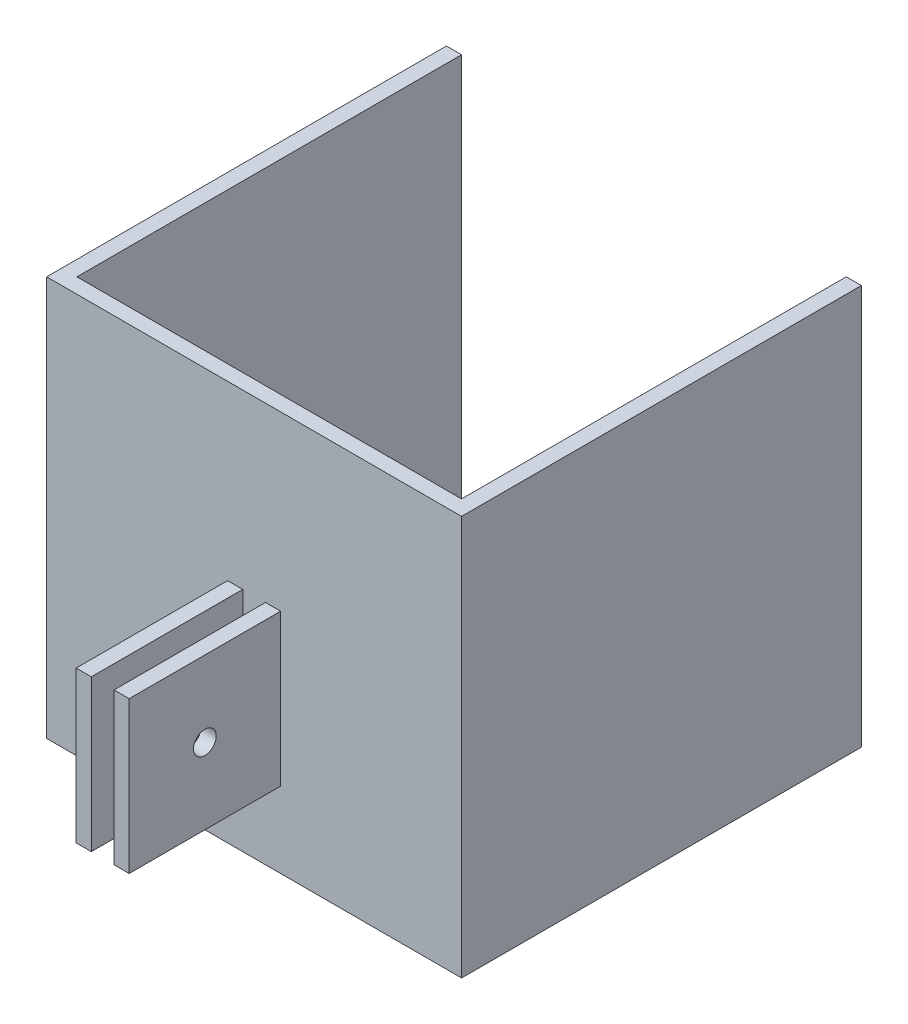
ISO-10303-21;
HEADER;
FILE_DESCRIPTION(('STEP AP214'),'2;1');
FILE_NAME('part.step','',(''),(''),'','','');
FILE_SCHEMA(('AUTOMOTIVE_DESIGN { 1 0 10303 214 1 1 1 1 }'));
ENDSEC;
DATA;
#1=APPLICATION_CONTEXT('core data for automotive mechanical design processes');
#2=APPLICATION_PROTOCOL_DEFINITION('international standard','automotive_design',2000,#1);
#3=PRODUCT_CONTEXT('',#1,'mechanical');
#4=PRODUCT('Part','Part','',(#3));
#5=PRODUCT_RELATED_PRODUCT_CATEGORY('part','',(#4));
#6=PRODUCT_DEFINITION_FORMATION('','',#4);
#7=PRODUCT_DEFINITION_CONTEXT('part definition',#1,'design');
#8=PRODUCT_DEFINITION('design','',#6,#7);
#9=PRODUCT_DEFINITION_SHAPE('','',#8);
#10=(LENGTH_UNIT() NAMED_UNIT(*) SI_UNIT(.MILLI.,.METRE.));
#11=(NAMED_UNIT(*) PLANE_ANGLE_UNIT() SI_UNIT($,.RADIAN.));
#12=(NAMED_UNIT(*) SI_UNIT($,.STERADIAN.) SOLID_ANGLE_UNIT());
#13=UNCERTAINTY_MEASURE_WITH_UNIT(LENGTH_MEASURE(1.E-05),#10,'distance_accuracy_value','');
#14=(GEOMETRIC_REPRESENTATION_CONTEXT(3) GLOBAL_UNCERTAINTY_ASSIGNED_CONTEXT((#13)) GLOBAL_UNIT_ASSIGNED_CONTEXT((#10,
#11,#12)) REPRESENTATION_CONTEXT('',''));
#15=CARTESIAN_POINT('',(0.,0.,0.));
#16=DIRECTION('',(0.,0.,1.));
#17=DIRECTION('',(1.,0.,0.));
#18=AXIS2_PLACEMENT_3D('',#15,#16,#17);
#19=CARTESIAN_POINT('',(0.,2.,2.));
#20=DIRECTION('',(0.,0.,-1.));
#21=DIRECTION('',(-1.,0.,0.));
#22=AXIS2_PLACEMENT_3D('',#19,#20,#21);
#23=PLANE('',#22);
#24=DIRECTION('',(0.,-1.,0.));
#25=VECTOR('',#24,1.);
#26=CARTESIAN_POINT('',(21.9,30.,2.));
#27=LINE('',#26,#25);
#28=CARTESIAN_POINT('',(21.9,30.,2.));
#29=VERTEX_POINT('',#28);
#30=CARTESIAN_POINT('',(21.9,10.,2.));
#31=VERTEX_POINT('',#30);
#32=EDGE_CURVE('E66',#29,#31,#27,.T.);
#33=ORIENTED_EDGE('',*,*,#32,.F.);
#34=DIRECTION('',(1.,0.,0.));
#35=VECTOR('',#34,1.);
#36=CARTESIAN_POINT('',(0.,30.,2.));
#37=LINE('',#36,#35);
#38=CARTESIAN_POINT('',(23.9,30.,2.));
#39=VERTEX_POINT('',#38);
#40=EDGE_CURVE('E61',#29,#39,#37,.T.);
#41=ORIENTED_EDGE('',*,*,#40,.T.);
#42=DIRECTION('',(0.,-1.,0.));
#43=VECTOR('',#42,1.);
#44=CARTESIAN_POINT('',(23.9,30.,2.));
#45=LINE('',#44,#43);
#46=CARTESIAN_POINT('',(23.9,10.,2.));
#47=VERTEX_POINT('',#46);
#48=EDGE_CURVE('E170',#39,#47,#45,.T.);
#49=ORIENTED_EDGE('',*,*,#48,.T.);
#50=DIRECTION('',(1.,0.,0.));
#51=VECTOR('',#50,1.);
#52=CARTESIAN_POINT('',(0.,10.,2.));
#53=LINE('',#52,#51);
#54=EDGE_CURVE('E179',#31,#47,#53,.T.);
#55=ORIENTED_EDGE('',*,*,#54,.F.);
#56=EDGE_LOOP('',(#33,#41,#49,#55));
#57=FACE_BOUND('',#56,.T.);
#58=DIRECTION('',(1.,0.,0.));
#59=VECTOR('',#58,1.);
#60=CARTESIAN_POINT('',(0.,0.,2.));
#61=LINE('',#60,#59);
#62=CARTESIAN_POINT('',(-1.99999999999999,0.,2.));
#63=VERTEX_POINT('',#62);
#64=CARTESIAN_POINT('',(52.8,0.,2.));
#65=VERTEX_POINT('',#64);
#66=EDGE_CURVE('E325',#63,#65,#61,.T.);
#67=ORIENTED_EDGE('',*,*,#66,.T.);
#68=DIRECTION('',(0.,-1.,0.));
#69=VECTOR('',#68,1.);
#70=CARTESIAN_POINT('',(52.8,2.,2.));
#71=LINE('',#70,#69);
#72=CARTESIAN_POINT('',(52.8,52.8,2.));
#73=VERTEX_POINT('',#72);
#74=EDGE_CURVE('E333',#73,#65,#71,.T.);
#75=ORIENTED_EDGE('',*,*,#74,.F.);
#76=DIRECTION('',(-1.,0.,0.));
#77=VECTOR('',#76,1.);
#78=CARTESIAN_POINT('',(0.,52.8,2.));
#79=LINE('',#78,#77);
#80=CARTESIAN_POINT('',(-1.99999999999999,52.8,2.));
#81=VERTEX_POINT('',#80);
#82=EDGE_CURVE('E276',#73,#81,#79,.T.);
#83=ORIENTED_EDGE('',*,*,#82,.T.);
#84=DIRECTION('',(0.,-1.,0.));
#85=VECTOR('',#84,1.);
#86=CARTESIAN_POINT('',(-1.99999999999999,2.,2.));
#87=LINE('',#86,#85);
#88=EDGE_CURVE('E54',#81,#63,#87,.T.);
#89=ORIENTED_EDGE('',*,*,#88,.T.);
#90=EDGE_LOOP('',(#67,#75,#83,#89));
#91=FACE_BOUND('',#90,.T.);
#92=DIRECTION('',(1.,0.,0.));
#93=VECTOR('',#92,1.);
#94=CARTESIAN_POINT('',(0.,10.,2.));
#95=LINE('',#94,#93);
#96=CARTESIAN_POINT('',(26.9,10.,2.));
#97=VERTEX_POINT('',#96);
#98=CARTESIAN_POINT('',(28.9,10.,2.));
#99=VERTEX_POINT('',#98);
#100=EDGE_CURVE('E239',#97,#99,#95,.T.);
#101=ORIENTED_EDGE('',*,*,#100,.F.);
#102=DIRECTION('',(0.,1.,0.));
#103=VECTOR('',#102,1.);
#104=CARTESIAN_POINT('',(26.9,10.,2.));
#105=LINE('',#104,#103);
#106=CARTESIAN_POINT('',(26.9,30.,2.));
#107=VERTEX_POINT('',#106);
#108=EDGE_CURVE('E243',#97,#107,#105,.T.);
#109=ORIENTED_EDGE('',*,*,#108,.T.);
#110=DIRECTION('',(1.,0.,0.));
#111=VECTOR('',#110,1.);
#112=CARTESIAN_POINT('',(0.,30.,2.));
#113=LINE('',#112,#111);
#114=CARTESIAN_POINT('',(28.9,30.,2.));
#115=VERTEX_POINT('',#114);
#116=EDGE_CURVE('E224',#107,#115,#113,.T.);
#117=ORIENTED_EDGE('',*,*,#116,.T.);
#118=DIRECTION('',(0.,1.,0.));
#119=VECTOR('',#118,1.);
#120=CARTESIAN_POINT('',(28.9,10.,2.));
#121=LINE('',#120,#119);
#122=EDGE_CURVE('E248',#99,#115,#121,.T.);
#123=ORIENTED_EDGE('',*,*,#122,.F.);
#124=EDGE_LOOP('',(#101,#109,#117,#123));
#125=FACE_BOUND('',#124,.T.);
#126=ADVANCED_FACE('F45',(#57,#91,#125),#23,.F.);
#127=CARTESIAN_POINT('',(0.,2.,0.));
#128=DIRECTION('',(0.,1.,0.));
#129=DIRECTION('',(0.,0.,1.));
#130=AXIS2_PLACEMENT_3D('',#127,#128,#129);
#131=PLANE('',#130);
#132=DIRECTION('',(-1.,0.,0.));
#133=VECTOR('',#132,1.);
#134=CARTESIAN_POINT('',(0.,2.,-50.8));
#135=LINE('',#134,#133);
#136=CARTESIAN_POINT('',(50.8,2.,-50.8));
#137=VERTEX_POINT('',#136);
#138=CARTESIAN_POINT('',(0.,2.,-50.8));
#139=VERTEX_POINT('',#138);
#140=EDGE_CURVE('E314',#137,#139,#135,.T.);
#141=ORIENTED_EDGE('',*,*,#140,.T.);
#142=DIRECTION('',(0.,0.,1.));
#143=VECTOR('',#142,1.);
#144=CARTESIAN_POINT('',(0.,2.,0.));
#145=LINE('',#144,#143);
#146=CARTESIAN_POINT('',(0.,2.,0.));
#147=VERTEX_POINT('',#146);
#148=EDGE_CURVE('E247',#139,#147,#145,.T.);
#149=ORIENTED_EDGE('',*,*,#148,.T.);
#150=DIRECTION('',(-1.,0.,0.));
#151=VECTOR('',#150,1.);
#152=CARTESIAN_POINT('',(0.,2.,0.));
#153=LINE('',#152,#151);
#154=CARTESIAN_POINT('',(50.8,2.,0.));
#155=VERTEX_POINT('',#154);
#156=EDGE_CURVE('E291',#155,#147,#153,.T.);
#157=ORIENTED_EDGE('',*,*,#156,.F.);
#158=DIRECTION('',(0.,0.,1.));
#159=VECTOR('',#158,1.);
#160=CARTESIAN_POINT('',(50.8,2.,0.));
#161=LINE('',#160,#159);
#162=EDGE_CURVE('E262',#137,#155,#161,.T.);
#163=ORIENTED_EDGE('',*,*,#162,.F.);
#164=EDGE_LOOP('',(#141,#149,#157,#163));
#165=FACE_BOUND('',#164,.T.);
#166=ADVANCED_FACE('F366',(#165),#131,.T.);
#167=CARTESIAN_POINT('',(0.,2.,-50.8));
#168=DIRECTION('',(0.,0.,1.));
#169=DIRECTION('',(1.,0.,0.));
#170=AXIS2_PLACEMENT_3D('',#167,#168,#169);
#171=PLANE('',#170);
#172=DIRECTION('',(-1.,0.,0.));
#173=VECTOR('',#172,1.);
#174=CARTESIAN_POINT('',(0.,0.,-50.8));
#175=LINE('',#174,#173);
#176=CARTESIAN_POINT('',(52.8,0.,-50.8));
#177=VERTEX_POINT('',#176);
#178=CARTESIAN_POINT('',(-2.,0.,-50.8));
#179=VERTEX_POINT('',#178);
#180=EDGE_CURVE('E302',#177,#179,#175,.T.);
#181=ORIENTED_EDGE('',*,*,#180,.T.);
#182=DIRECTION('',(0.,-1.,0.));
#183=VECTOR('',#182,1.);
#184=CARTESIAN_POINT('',(-2.,2.,-50.8));
#185=LINE('',#184,#183);
#186=CARTESIAN_POINT('',(-2.,52.8,-50.8));
#187=VERTEX_POINT('',#186);
#188=EDGE_CURVE('E11',#187,#179,#185,.T.);
#189=ORIENTED_EDGE('',*,*,#188,.F.);
#190=DIRECTION('',(1.,0.,0.));
#191=VECTOR('',#190,1.);
#192=CARTESIAN_POINT('',(0.,52.8,-50.8));
#193=LINE('',#192,#191);
#194=CARTESIAN_POINT('',(0.,52.8,-50.8));
#195=VERTEX_POINT('',#194);
#196=EDGE_CURVE('E284',#187,#195,#193,.T.);
#197=ORIENTED_EDGE('',*,*,#196,.T.);
#198=DIRECTION('',(0.,-1.,0.));
#199=VECTOR('',#198,1.);
#200=CARTESIAN_POINT('',(0.,52.8,-50.8));
#201=LINE('',#200,#199);
#202=EDGE_CURVE('E298',#195,#139,#201,.T.);
#203=ORIENTED_EDGE('',*,*,#202,.T.);
#204=ORIENTED_EDGE('',*,*,#140,.F.);
#205=DIRECTION('',(0.,-1.,0.));
#206=VECTOR('',#205,1.);
#207=CARTESIAN_POINT('',(50.8,52.8,-50.8));
#208=LINE('',#207,#206);
#209=CARTESIAN_POINT('',(50.8,52.8,-50.8));
#210=VERTEX_POINT('',#209);
#211=EDGE_CURVE('E303',#210,#137,#208,.T.);
#212=ORIENTED_EDGE('',*,*,#211,.F.);
#213=DIRECTION('',(1.,0.,0.));
#214=VECTOR('',#213,1.);
#215=CARTESIAN_POINT('',(0.,52.8,-50.8));
#216=LINE('',#215,#214);
#217=CARTESIAN_POINT('',(52.8,52.8,-50.8));
#218=VERTEX_POINT('',#217);
#219=EDGE_CURVE('E268',#210,#218,#216,.T.);
#220=ORIENTED_EDGE('',*,*,#219,.T.);
#221=DIRECTION('',(0.,-1.,0.));
#222=VECTOR('',#221,1.);
#223=CARTESIAN_POINT('',(52.8,2.,-50.8));
#224=LINE('',#223,#222);
#225=EDGE_CURVE('E317',#218,#177,#224,.T.);
#226=ORIENTED_EDGE('',*,*,#225,.T.);
#227=EDGE_LOOP('',(#181,#189,#197,#203,#204,#212,#220,#226));
#228=FACE_BOUND('',#227,.T.);
#229=ADVANCED_FACE('F47',(#228),#171,.F.);
#230=CARTESIAN_POINT('',(-1.99999999999999,2.,0.));
#231=DIRECTION('',(1.,0.,0.));
#232=DIRECTION('',(0.,0.,-1.));
#233=AXIS2_PLACEMENT_3D('',#230,#231,#232);
#234=PLANE('',#233);
#235=DIRECTION('',(0.,0.,1.));
#236=VECTOR('',#235,1.);
#237=CARTESIAN_POINT('',(-1.99999999999999,0.,0.));
#238=LINE('',#237,#236);
#239=EDGE_CURVE('E322',#179,#63,#238,.T.);
#240=ORIENTED_EDGE('',*,*,#239,.T.);
#241=ORIENTED_EDGE('',*,*,#88,.F.);
#242=DIRECTION('',(0.,0.,-1.));
#243=VECTOR('',#242,1.);
#244=CARTESIAN_POINT('',(-1.99999999999999,52.8,0.));
#245=LINE('',#244,#243);
#246=EDGE_CURVE('E280',#81,#187,#245,.T.);
#247=ORIENTED_EDGE('',*,*,#246,.T.);
#248=ORIENTED_EDGE('',*,*,#188,.T.);
#249=EDGE_LOOP('',(#240,#241,#247,#248));
#250=FACE_BOUND('',#249,.T.);
#251=ADVANCED_FACE('F360',(#250),#234,.F.);
#252=CARTESIAN_POINT('',(52.8,2.,0.));
#253=DIRECTION('',(-1.,0.,0.));
#254=DIRECTION('',(0.,0.,1.));
#255=AXIS2_PLACEMENT_3D('',#252,#253,#254);
#256=PLANE('',#255);
#257=DIRECTION('',(0.,0.,-1.));
#258=VECTOR('',#257,1.);
#259=CARTESIAN_POINT('',(52.8,0.,0.));
#260=LINE('',#259,#258);
#261=EDGE_CURVE('E318',#65,#177,#260,.T.);
#262=ORIENTED_EDGE('',*,*,#261,.T.);
#263=ORIENTED_EDGE('',*,*,#225,.F.);
#264=DIRECTION('',(0.,0.,1.));
#265=VECTOR('',#264,1.);
#266=CARTESIAN_POINT('',(52.8,52.8,0.));
#267=LINE('',#266,#265);
#268=EDGE_CURVE('E272',#218,#73,#267,.T.);
#269=ORIENTED_EDGE('',*,*,#268,.T.);
#270=ORIENTED_EDGE('',*,*,#74,.T.);
#271=EDGE_LOOP('',(#262,#263,#269,#270));
#272=FACE_BOUND('',#271,.T.);
#273=ADVANCED_FACE('F349',(#272),#256,.F.);
#274=CARTESIAN_POINT('',(0.,0.,0.));
#275=DIRECTION('',(0.,1.,0.));
#276=DIRECTION('',(0.,0.,1.));
#277=AXIS2_PLACEMENT_3D('',#274,#275,#276);
#278=PLANE('',#277);
#279=ORIENTED_EDGE('',*,*,#180,.F.);
#280=ORIENTED_EDGE('',*,*,#261,.F.);
#281=ORIENTED_EDGE('',*,*,#66,.F.);
#282=ORIENTED_EDGE('',*,*,#239,.F.);
#283=EDGE_LOOP('',(#279,#280,#281,#282));
#284=FACE_BOUND('',#283,.T.);
#285=ADVANCED_FACE('F347',(#284),#278,.F.);
#286=CARTESIAN_POINT('',(0.,52.8,0.));
#287=DIRECTION('',(1.,0.,0.));
#288=DIRECTION('',(0.,0.,-1.));
#289=AXIS2_PLACEMENT_3D('',#286,#287,#288);
#290=PLANE('',#289);
#291=ORIENTED_EDGE('',*,*,#148,.F.);
#292=ORIENTED_EDGE('',*,*,#202,.F.);
#293=DIRECTION('',(0.,0.,1.));
#294=VECTOR('',#293,1.);
#295=CARTESIAN_POINT('',(0.,52.8,0.));
#296=LINE('',#295,#294);
#297=CARTESIAN_POINT('',(0.,52.8,0.));
#298=VERTEX_POINT('',#297);
#299=EDGE_CURVE('E257',#195,#298,#296,.T.);
#300=ORIENTED_EDGE('',*,*,#299,.T.);
#301=DIRECTION('',(0.,-1.,0.));
#302=VECTOR('',#301,1.);
#303=CARTESIAN_POINT('',(0.,52.8,0.));
#304=LINE('',#303,#302);
#305=EDGE_CURVE('E288',#298,#147,#304,.T.);
#306=ORIENTED_EDGE('',*,*,#305,.T.);
#307=EDGE_LOOP('',(#291,#292,#300,#306));
#308=FACE_BOUND('',#307,.T.);
#309=ADVANCED_FACE('F363',(#308),#290,.T.);
#310=CARTESIAN_POINT('',(50.8,52.8,0.));
#311=DIRECTION('',(1.,0.,0.));
#312=DIRECTION('',(0.,0.,-1.));
#313=AXIS2_PLACEMENT_3D('',#310,#311,#312);
#314=PLANE('',#313);
#315=ORIENTED_EDGE('',*,*,#162,.T.);
#316=DIRECTION('',(0.,-1.,0.));
#317=VECTOR('',#316,1.);
#318=CARTESIAN_POINT('',(50.8,52.8,0.));
#319=LINE('',#318,#317);
#320=CARTESIAN_POINT('',(50.8,52.8,0.));
#321=VERTEX_POINT('',#320);
#322=EDGE_CURVE('E307',#321,#155,#319,.T.);
#323=ORIENTED_EDGE('',*,*,#322,.F.);
#324=DIRECTION('',(0.,0.,1.));
#325=VECTOR('',#324,1.);
#326=CARTESIAN_POINT('',(50.8,52.8,0.));
#327=LINE('',#326,#325);
#328=EDGE_CURVE('E265',#210,#321,#327,.T.);
#329=ORIENTED_EDGE('',*,*,#328,.F.);
#330=ORIENTED_EDGE('',*,*,#211,.T.);
#331=EDGE_LOOP('',(#315,#323,#329,#330));
#332=FACE_BOUND('',#331,.T.);
#333=ADVANCED_FACE('F368',(#332),#314,.F.);
#334=CARTESIAN_POINT('',(0.,52.8,0.));
#335=DIRECTION('',(0.,0.,1.));
#336=DIRECTION('',(1.,0.,0.));
#337=AXIS2_PLACEMENT_3D('',#334,#335,#336);
#338=PLANE('',#337);
#339=ORIENTED_EDGE('',*,*,#156,.T.);
#340=ORIENTED_EDGE('',*,*,#305,.F.);
#341=DIRECTION('',(-1.,0.,0.));
#342=VECTOR('',#341,1.);
#343=CARTESIAN_POINT('',(0.,52.8,0.));
#344=LINE('',#343,#342);
#345=EDGE_CURVE('E261',#321,#298,#344,.T.);
#346=ORIENTED_EDGE('',*,*,#345,.F.);
#347=ORIENTED_EDGE('',*,*,#322,.T.);
#348=EDGE_LOOP('',(#339,#340,#346,#347));
#349=FACE_BOUND('',#348,.T.);
#350=ADVANCED_FACE('F371',(#349),#338,.F.);
#351=CARTESIAN_POINT('',(0.,52.8,0.));
#352=DIRECTION('',(0.,-1.,0.));
#353=DIRECTION('',(0.,0.,-1.));
#354=AXIS2_PLACEMENT_3D('',#351,#352,#353);
#355=PLANE('',#354);
#356=ORIENTED_EDGE('',*,*,#299,.F.);
#357=ORIENTED_EDGE('',*,*,#196,.F.);
#358=ORIENTED_EDGE('',*,*,#246,.F.);
#359=ORIENTED_EDGE('',*,*,#82,.F.);
#360=ORIENTED_EDGE('',*,*,#268,.F.);
#361=ORIENTED_EDGE('',*,*,#219,.F.);
#362=ORIENTED_EDGE('',*,*,#328,.T.);
#363=ORIENTED_EDGE('',*,*,#345,.T.);
#364=EDGE_LOOP('',(#356,#357,#358,#359,#360,#361,#362,#363));
#365=FACE_BOUND('',#364,.T.);
#366=ADVANCED_FACE('F357',(#365),#355,.F.);
#367=CARTESIAN_POINT('',(26.9,10.,0.));
#368=DIRECTION('',(1.,0.,0.));
#369=DIRECTION('',(0.,0.,-1.));
#370=AXIS2_PLACEMENT_3D('',#367,#368,#369);
#371=PLANE('',#370);
#372=CARTESIAN_POINT('',(26.9,20.,12.));
#373=DIRECTION('',(1.,0.,0.));
#374=DIRECTION('',(0.,0.,-1.));
#375=AXIS2_PLACEMENT_3D('',#372,#373,#374);
#376=CIRCLE('',#375,1.5);
#377=CARTESIAN_POINT('',(26.9,20.,10.5));
#378=VERTEX_POINT('',#377);
#379=EDGE_CURVE('E186',#378,#378,#376,.T.);
#380=ORIENTED_EDGE('',*,*,#379,.T.);
#381=EDGE_LOOP('',(#380));
#382=FACE_BOUND('',#381,.T.);
#383=DIRECTION('',(0.,0.,-1.));
#384=VECTOR('',#383,1.);
#385=CARTESIAN_POINT('',(26.9,30.,0.));
#386=LINE('',#385,#384);
#387=CARTESIAN_POINT('',(26.9,30.,22.));
#388=VERTEX_POINT('',#387);
#389=EDGE_CURVE('E169',#388,#107,#386,.T.);
#390=ORIENTED_EDGE('',*,*,#389,.T.);
#391=ORIENTED_EDGE('',*,*,#108,.F.);
#392=DIRECTION('',(0.,0.,-1.));
#393=VECTOR('',#392,1.);
#394=CARTESIAN_POINT('',(26.9,10.,0.));
#395=LINE('',#394,#393);
#396=CARTESIAN_POINT('',(26.9,10.,22.));
#397=VERTEX_POINT('',#396);
#398=EDGE_CURVE('E228',#397,#97,#395,.T.);
#399=ORIENTED_EDGE('',*,*,#398,.F.);
#400=DIRECTION('',(0.,1.,0.));
#401=VECTOR('',#400,1.);
#402=CARTESIAN_POINT('',(26.9,10.,22.));
#403=LINE('',#402,#401);
#404=EDGE_CURVE('E242',#397,#388,#403,.T.);
#405=ORIENTED_EDGE('',*,*,#404,.T.);
#406=EDGE_LOOP('',(#390,#391,#399,#405));
#407=FACE_BOUND('',#406,.T.);
#408=ADVANCED_FACE('F378',(#382,#407),#371,.F.);
#409=CARTESIAN_POINT('',(28.9,10.,0.));
#410=DIRECTION('',(1.,0.,0.));
#411=DIRECTION('',(0.,0.,-1.));
#412=AXIS2_PLACEMENT_3D('',#409,#410,#411);
#413=PLANE('',#412);
#414=CARTESIAN_POINT('',(28.9,20.,12.));
#415=DIRECTION('',(1.,0.,0.));
#416=DIRECTION('',(0.,0.,-1.));
#417=AXIS2_PLACEMENT_3D('',#414,#415,#416);
#418=CIRCLE('',#417,1.5);
#419=CARTESIAN_POINT('',(28.9,20.,10.5));
#420=VERTEX_POINT('',#419);
#421=EDGE_CURVE('E596',#420,#420,#418,.T.);
#422=ORIENTED_EDGE('',*,*,#421,.F.);
#423=EDGE_LOOP('',(#422));
#424=FACE_BOUND('',#423,.T.);
#425=DIRECTION('',(0.,0.,-1.));
#426=VECTOR('',#425,1.);
#427=CARTESIAN_POINT('',(28.9,30.,0.));
#428=LINE('',#427,#426);
#429=CARTESIAN_POINT('',(28.9,30.,22.));
#430=VERTEX_POINT('',#429);
#431=EDGE_CURVE('E221',#430,#115,#428,.T.);
#432=ORIENTED_EDGE('',*,*,#431,.F.);
#433=DIRECTION('',(0.,1.,0.));
#434=VECTOR('',#433,1.);
#435=CARTESIAN_POINT('',(28.9,10.,22.));
#436=LINE('',#435,#434);
#437=CARTESIAN_POINT('',(28.9,10.,22.));
#438=VERTEX_POINT('',#437);
#439=EDGE_CURVE('E252',#438,#430,#436,.T.);
#440=ORIENTED_EDGE('',*,*,#439,.F.);
#441=DIRECTION('',(0.,0.,-1.));
#442=VECTOR('',#441,1.);
#443=CARTESIAN_POINT('',(28.9,10.,0.));
#444=LINE('',#443,#442);
#445=EDGE_CURVE('E235',#438,#99,#444,.T.);
#446=ORIENTED_EDGE('',*,*,#445,.T.);
#447=ORIENTED_EDGE('',*,*,#122,.T.);
#448=EDGE_LOOP('',(#432,#440,#446,#447));
#449=FACE_BOUND('',#448,.T.);
#450=ADVANCED_FACE('F456',(#424,#449),#413,.T.);
#451=CARTESIAN_POINT('',(0.,10.,22.));
#452=DIRECTION('',(0.,0.,1.));
#453=DIRECTION('',(1.,0.,0.));
#454=AXIS2_PLACEMENT_3D('',#451,#452,#453);
#455=PLANE('',#454);
#456=DIRECTION('',(1.,0.,0.));
#457=VECTOR('',#456,1.);
#458=CARTESIAN_POINT('',(0.,30.,22.));
#459=LINE('',#458,#457);
#460=EDGE_CURVE('E217',#388,#430,#459,.T.);
#461=ORIENTED_EDGE('',*,*,#460,.F.);
#462=ORIENTED_EDGE('',*,*,#404,.F.);
#463=DIRECTION('',(1.,0.,0.));
#464=VECTOR('',#463,1.);
#465=CARTESIAN_POINT('',(0.,10.,22.));
#466=LINE('',#465,#464);
#467=EDGE_CURVE('E231',#397,#438,#466,.T.);
#468=ORIENTED_EDGE('',*,*,#467,.T.);
#469=ORIENTED_EDGE('',*,*,#439,.T.);
#470=EDGE_LOOP('',(#461,#462,#468,#469));
#471=FACE_BOUND('',#470,.T.);
#472=ADVANCED_FACE('F450',(#471),#455,.T.);
#473=CARTESIAN_POINT('',(0.,10.,0.));
#474=DIRECTION('',(0.,1.,0.));
#475=DIRECTION('',(0.,0.,1.));
#476=AXIS2_PLACEMENT_3D('',#473,#474,#475);
#477=PLANE('',#476);
#478=ORIENTED_EDGE('',*,*,#398,.T.);
#479=ORIENTED_EDGE('',*,*,#100,.T.);
#480=ORIENTED_EDGE('',*,*,#445,.F.);
#481=ORIENTED_EDGE('',*,*,#467,.F.);
#482=EDGE_LOOP('',(#478,#479,#480,#481));
#483=FACE_BOUND('',#482,.T.);
#484=ADVANCED_FACE('F455',(#483),#477,.F.);
#485=CARTESIAN_POINT('',(0.,30.,0.));
#486=DIRECTION('',(0.,1.,0.));
#487=DIRECTION('',(0.,0.,1.));
#488=AXIS2_PLACEMENT_3D('',#485,#486,#487);
#489=PLANE('',#488);
#490=ORIENTED_EDGE('',*,*,#389,.F.);
#491=ORIENTED_EDGE('',*,*,#460,.T.);
#492=ORIENTED_EDGE('',*,*,#431,.T.);
#493=ORIENTED_EDGE('',*,*,#116,.F.);
#494=EDGE_LOOP('',(#490,#491,#492,#493));
#495=FACE_BOUND('',#494,.T.);
#496=ADVANCED_FACE('F469',(#495),#489,.T.);
#497=CARTESIAN_POINT('',(0.,30.,22.));
#498=DIRECTION('',(0.,0.,-1.));
#499=DIRECTION('',(-1.,0.,0.));
#500=AXIS2_PLACEMENT_3D('',#497,#498,#499);
#501=PLANE('',#500);
#502=DIRECTION('',(0.,-1.,0.));
#503=VECTOR('',#502,1.);
#504=CARTESIAN_POINT('',(21.9,30.,22.));
#505=LINE('',#504,#503);
#506=CARTESIAN_POINT('',(21.9,30.,22.));
#507=VERTEX_POINT('',#506);
#508=CARTESIAN_POINT('',(21.9,10.,22.));
#509=VERTEX_POINT('',#508);
#510=EDGE_CURVE('E184',#507,#509,#505,.T.);
#511=ORIENTED_EDGE('',*,*,#510,.T.);
#512=DIRECTION('',(1.,0.,0.));
#513=VECTOR('',#512,1.);
#514=CARTESIAN_POINT('',(0.,10.,22.));
#515=LINE('',#514,#513);
#516=CARTESIAN_POINT('',(23.9,10.,22.));
#517=VERTEX_POINT('',#516);
#518=EDGE_CURVE('E177',#509,#517,#515,.T.);
#519=ORIENTED_EDGE('',*,*,#518,.T.);
#520=DIRECTION('',(0.,-1.,0.));
#521=VECTOR('',#520,1.);
#522=CARTESIAN_POINT('',(23.9,30.,22.));
#523=LINE('',#522,#521);
#524=CARTESIAN_POINT('',(23.9,30.,22.));
#525=VERTEX_POINT('',#524);
#526=EDGE_CURVE('E158',#525,#517,#523,.T.);
#527=ORIENTED_EDGE('',*,*,#526,.F.);
#528=DIRECTION('',(1.,0.,0.));
#529=VECTOR('',#528,1.);
#530=CARTESIAN_POINT('',(0.,30.,22.));
#531=LINE('',#530,#529);
#532=EDGE_CURVE('E199',#507,#525,#531,.T.);
#533=ORIENTED_EDGE('',*,*,#532,.F.);
#534=EDGE_LOOP('',(#511,#519,#527,#533));
#535=FACE_BOUND('',#534,.T.);
#536=ADVANCED_FACE('F182',(#535),#501,.F.);
#537=CARTESIAN_POINT('',(23.9,30.,0.));
#538=DIRECTION('',(-1.,0.,0.));
#539=DIRECTION('',(0.,0.,1.));
#540=AXIS2_PLACEMENT_3D('',#537,#538,#539);
#541=PLANE('',#540);
#542=CARTESIAN_POINT('',(23.9,20.,12.));
#543=DIRECTION('',(-1.,0.,0.));
#544=DIRECTION('',(0.,0.,1.));
#545=AXIS2_PLACEMENT_3D('',#542,#543,#544);
#546=CIRCLE('',#545,1.5);
#547=CARTESIAN_POINT('',(23.9,20.,13.5));
#548=VERTEX_POINT('',#547);
#549=EDGE_CURVE('E190',#548,#548,#546,.T.);
#550=ORIENTED_EDGE('',*,*,#549,.T.);
#551=EDGE_LOOP('',(#550));
#552=FACE_BOUND('',#551,.T.);
#553=ORIENTED_EDGE('',*,*,#526,.T.);
#554=DIRECTION('',(0.,0.,-1.));
#555=VECTOR('',#554,1.);
#556=CARTESIAN_POINT('',(23.9,10.,0.));
#557=LINE('',#556,#555);
#558=EDGE_CURVE('E162',#517,#47,#557,.T.);
#559=ORIENTED_EDGE('',*,*,#558,.T.);
#560=ORIENTED_EDGE('',*,*,#48,.F.);
#561=DIRECTION('',(0.,0.,-1.));
#562=VECTOR('',#561,1.);
#563=CARTESIAN_POINT('',(23.9,30.,0.));
#564=LINE('',#563,#562);
#565=EDGE_CURVE('E163',#525,#39,#564,.T.);
#566=ORIENTED_EDGE('',*,*,#565,.F.);
#567=EDGE_LOOP('',(#553,#559,#560,#566));
#568=FACE_BOUND('',#567,.T.);
#569=ADVANCED_FACE('F160',(#552,#568),#541,.F.);
#570=CARTESIAN_POINT('',(21.9,30.,0.));
#571=DIRECTION('',(1.,0.,0.));
#572=DIRECTION('',(0.,0.,-1.));
#573=AXIS2_PLACEMENT_3D('',#570,#571,#572);
#574=PLANE('',#573);
#575=CARTESIAN_POINT('',(21.9,20.,12.));
#576=DIRECTION('',(1.,0.,0.));
#577=DIRECTION('',(0.,0.,-1.));
#578=AXIS2_PLACEMENT_3D('',#575,#576,#577);
#579=CIRCLE('',#578,1.5);
#580=CARTESIAN_POINT('',(21.9,20.,10.5));
#581=VERTEX_POINT('',#580);
#582=EDGE_CURVE('E611',#581,#581,#579,.F.);
#583=ORIENTED_EDGE('',*,*,#582,.F.);
#584=EDGE_LOOP('',(#583));
#585=FACE_BOUND('',#584,.T.);
#586=ORIENTED_EDGE('',*,*,#32,.T.);
#587=DIRECTION('',(0.,0.,1.));
#588=VECTOR('',#587,1.);
#589=CARTESIAN_POINT('',(21.9,10.,0.));
#590=LINE('',#589,#588);
#591=EDGE_CURVE('E196',#31,#509,#590,.T.);
#592=ORIENTED_EDGE('',*,*,#591,.T.);
#593=ORIENTED_EDGE('',*,*,#510,.F.);
#594=DIRECTION('',(0.,0.,1.));
#595=VECTOR('',#594,1.);
#596=CARTESIAN_POINT('',(21.9,30.,0.));
#597=LINE('',#596,#595);
#598=EDGE_CURVE('E206',#29,#507,#597,.T.);
#599=ORIENTED_EDGE('',*,*,#598,.F.);
#600=EDGE_LOOP('',(#586,#592,#593,#599));
#601=FACE_BOUND('',#600,.T.);
#602=ADVANCED_FACE('F502',(#585,#601),#574,.F.);
#603=CARTESIAN_POINT('',(0.,30.,0.));
#604=DIRECTION('',(0.,1.,0.));
#605=DIRECTION('',(0.,0.,1.));
#606=AXIS2_PLACEMENT_3D('',#603,#604,#605);
#607=PLANE('',#606);
#608=ORIENTED_EDGE('',*,*,#532,.T.);
#609=ORIENTED_EDGE('',*,*,#565,.T.);
#610=ORIENTED_EDGE('',*,*,#40,.F.);
#611=ORIENTED_EDGE('',*,*,#598,.T.);
#612=EDGE_LOOP('',(#608,#609,#610,#611));
#613=FACE_BOUND('',#612,.T.);
#614=ADVANCED_FACE('F497',(#613),#607,.T.);
#615=CARTESIAN_POINT('',(0.,10.,0.));
#616=DIRECTION('',(0.,1.,0.));
#617=DIRECTION('',(0.,0.,1.));
#618=AXIS2_PLACEMENT_3D('',#615,#616,#617);
#619=PLANE('',#618);
#620=ORIENTED_EDGE('',*,*,#518,.F.);
#621=ORIENTED_EDGE('',*,*,#591,.F.);
#622=ORIENTED_EDGE('',*,*,#54,.T.);
#623=ORIENTED_EDGE('',*,*,#558,.F.);
#624=EDGE_LOOP('',(#620,#621,#622,#623));
#625=FACE_BOUND('',#624,.T.);
#626=ADVANCED_FACE('F175',(#625),#619,.F.);
#627=CARTESIAN_POINT('',(17.6573593128807,20.,12.));
#628=DIRECTION('',(1.,0.,0.));
#629=DIRECTION('',(0.,0.,-1.));
#630=AXIS2_PLACEMENT_3D('',#627,#628,#629);
#631=CYLINDRICAL_SURFACE('',#630,1.5);
#632=ORIENTED_EDGE('',*,*,#582,.T.);
#633=EDGE_LOOP('',(#632));
#634=FACE_BOUND('',#633,.T.);
#635=ORIENTED_EDGE('',*,*,#549,.F.);
#636=EDGE_LOOP('',(#635));
#637=FACE_BOUND('',#636,.T.);
#638=ADVANCED_FACE('F515',(#634,#637),#631,.F.);
#639=ORIENTED_EDGE('',*,*,#421,.T.);
#640=EDGE_LOOP('',(#639));
#641=FACE_BOUND('',#640,.T.);
#642=ORIENTED_EDGE('',*,*,#379,.F.);
#643=EDGE_LOOP('',(#642));
#644=FACE_BOUND('',#643,.T.);
#645=ADVANCED_FACE('F557',(#641,#644),#631,.F.);
#646=CLOSED_SHELL('',(#126,#166,#229,#251,#273,#285,#309,#333,#350,#366,#408,#450,#472,#484,
#496,#536,#569,#602,#614,#626,#638,#645));
#647=MANIFOLD_SOLID_BREP('B2',#646);
#648=ADVANCED_BREP_SHAPE_REPRESENTATION('',(#18,#647),#14);
#649=SHAPE_DEFINITION_REPRESENTATION(#9,#648);
ENDSEC;
END-ISO-10303-21;
